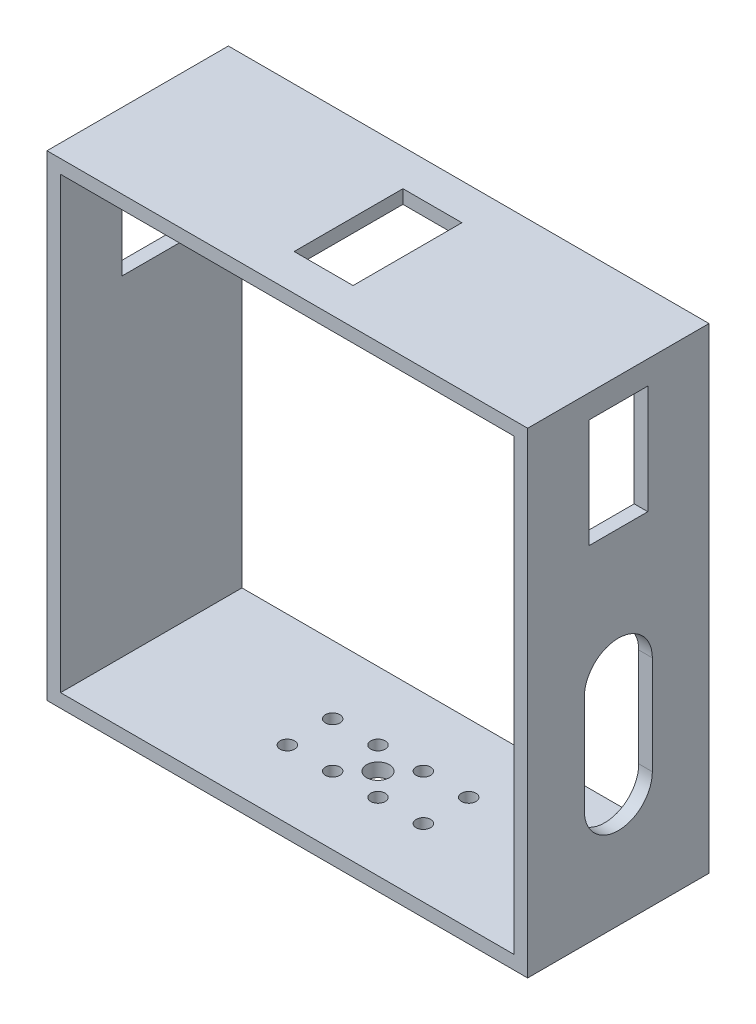
ISO-10303-21;
HEADER;
FILE_DESCRIPTION(('STEP AP214'),'2;1');
FILE_NAME('part.step','',(''),(''),'','','');
FILE_SCHEMA(('AUTOMOTIVE_DESIGN { 1 0 10303 214 1 1 1 1 }'));
ENDSEC;
DATA;
#1=APPLICATION_CONTEXT('core data for automotive mechanical design processes');
#2=APPLICATION_PROTOCOL_DEFINITION('international standard','automotive_design',2000,#1);
#3=PRODUCT_CONTEXT('',#1,'mechanical');
#4=PRODUCT('Part','Part','',(#3));
#5=PRODUCT_RELATED_PRODUCT_CATEGORY('part','',(#4));
#6=PRODUCT_DEFINITION_FORMATION('','',#4);
#7=PRODUCT_DEFINITION_CONTEXT('part definition',#1,'design');
#8=PRODUCT_DEFINITION('design','',#6,#7);
#9=PRODUCT_DEFINITION_SHAPE('','',#8);
#10=(LENGTH_UNIT() NAMED_UNIT(*) SI_UNIT(.MILLI.,.METRE.));
#11=(NAMED_UNIT(*) PLANE_ANGLE_UNIT() SI_UNIT($,.RADIAN.));
#12=(NAMED_UNIT(*) SI_UNIT($,.STERADIAN.) SOLID_ANGLE_UNIT());
#13=UNCERTAINTY_MEASURE_WITH_UNIT(LENGTH_MEASURE(1.E-05),#10,'distance_accuracy_value','');
#14=(GEOMETRIC_REPRESENTATION_CONTEXT(3) GLOBAL_UNCERTAINTY_ASSIGNED_CONTEXT((#13)) GLOBAL_UNIT_ASSIGNED_CONTEXT((#10,
#11,#12)) REPRESENTATION_CONTEXT('',''));
#15=CARTESIAN_POINT('',(0.,0.,0.));
#16=DIRECTION('',(0.,0.,1.));
#17=DIRECTION('',(1.,0.,0.));
#18=AXIS2_PLACEMENT_3D('',#15,#16,#17);
#19=CARTESIAN_POINT('',(-53.,105.,40.));
#20=DIRECTION('',(0.,-1.,0.));
#21=DIRECTION('',(0.,0.,-1.));
#22=AXIS2_PLACEMENT_3D('',#19,#20,#21);
#23=PLANE('',#22);
#24=DIRECTION('',(-1.,0.,0.));
#25=VECTOR('',#24,1.);
#26=CARTESIAN_POINT('',(-53.,105.,0.));
#27=LINE('',#26,#25);
#28=CARTESIAN_POINT('',(53.,105.,0.));
#29=VERTEX_POINT('',#28);
#30=CARTESIAN_POINT('',(-53.,105.,0.));
#31=VERTEX_POINT('',#30);
#32=EDGE_CURVE('E370',#29,#31,#27,.T.);
#33=ORIENTED_EDGE('',*,*,#32,.T.);
#34=DIRECTION('',(0.,0.,-1.));
#35=VECTOR('',#34,1.);
#36=CARTESIAN_POINT('',(-53.,105.,40.));
#37=LINE('',#36,#35);
#38=CARTESIAN_POINT('',(-53.,105.,40.));
#39=VERTEX_POINT('',#38);
#40=EDGE_CURVE('E380',#39,#31,#37,.T.);
#41=ORIENTED_EDGE('',*,*,#40,.F.);
#42=DIRECTION('',(-1.,0.,0.));
#43=VECTOR('',#42,1.);
#44=CARTESIAN_POINT('',(-53.,105.,40.));
#45=LINE('',#44,#43);
#46=CARTESIAN_POINT('',(53.,105.,40.));
#47=VERTEX_POINT('',#46);
#48=EDGE_CURVE('E360',#47,#39,#45,.T.);
#49=ORIENTED_EDGE('',*,*,#48,.F.);
#50=DIRECTION('',(0.,0.,-1.));
#51=VECTOR('',#50,1.);
#52=CARTESIAN_POINT('',(53.,105.,40.));
#53=LINE('',#52,#51);
#54=EDGE_CURVE('E383',#47,#29,#53,.T.);
#55=ORIENTED_EDGE('',*,*,#54,.T.);
#56=EDGE_LOOP('',(#33,#41,#49,#55));
#57=FACE_BOUND('',#56,.T.);
#58=DIRECTION('',(-1.,0.,0.));
#59=VECTOR('',#58,1.);
#60=CARTESIAN_POINT('',(-53.,105.,7.99999999999999));
#61=LINE('',#60,#59);
#62=CARTESIAN_POINT('',(6.50000000000001,105.,7.99999999999999));
#63=VERTEX_POINT('',#62);
#64=CARTESIAN_POINT('',(-6.50000000000001,105.,7.99999999999999));
#65=VERTEX_POINT('',#64);
#66=EDGE_CURVE('E277',#63,#65,#61,.T.);
#67=ORIENTED_EDGE('',*,*,#66,.F.);
#68=DIRECTION('',(0.,0.,-1.));
#69=VECTOR('',#68,1.);
#70=CARTESIAN_POINT('',(6.50000000000001,105.,40.));
#71=LINE('',#70,#69);
#72=CARTESIAN_POINT('',(6.50000000000001,105.,32.));
#73=VERTEX_POINT('',#72);
#74=EDGE_CURVE('E270',#73,#63,#71,.T.);
#75=ORIENTED_EDGE('',*,*,#74,.F.);
#76=DIRECTION('',(1.,0.,0.));
#77=VECTOR('',#76,1.);
#78=CARTESIAN_POINT('',(-53.,105.,32.));
#79=LINE('',#78,#77);
#80=CARTESIAN_POINT('',(-6.50000000000001,105.,32.));
#81=VERTEX_POINT('',#80);
#82=EDGE_CURVE('E272',#81,#73,#79,.T.);
#83=ORIENTED_EDGE('',*,*,#82,.F.);
#84=DIRECTION('',(0.,0.,1.));
#85=VECTOR('',#84,1.);
#86=CARTESIAN_POINT('',(-6.50000000000001,105.,40.));
#87=LINE('',#86,#85);
#88=EDGE_CURVE('E275',#65,#81,#87,.T.);
#89=ORIENTED_EDGE('',*,*,#88,.F.);
#90=EDGE_LOOP('',(#67,#75,#83,#89));
#91=FACE_BOUND('',#90,.T.);
#92=ADVANCED_FACE('F38',(#57,#91),#23,.F.);
#93=CARTESIAN_POINT('',(50.,102.,40.));
#94=DIRECTION('',(0.,1.,0.));
#95=DIRECTION('',(0.,0.,1.));
#96=AXIS2_PLACEMENT_3D('',#93,#94,#95);
#97=PLANE('',#96);
#98=DIRECTION('',(1.,0.,0.));
#99=VECTOR('',#98,1.);
#100=CARTESIAN_POINT('',(0.,102.,0.));
#101=LINE('',#100,#99);
#102=CARTESIAN_POINT('',(-50.,102.,0.));
#103=VERTEX_POINT('',#102);
#104=CARTESIAN_POINT('',(50.,102.,0.));
#105=VERTEX_POINT('',#104);
#106=EDGE_CURVE('E390',#103,#105,#101,.T.);
#107=ORIENTED_EDGE('',*,*,#106,.T.);
#108=DIRECTION('',(0.,0.,-1.));
#109=VECTOR('',#108,1.);
#110=CARTESIAN_POINT('',(50.,102.,40.));
#111=LINE('',#110,#109);
#112=CARTESIAN_POINT('',(50.,102.,40.));
#113=VERTEX_POINT('',#112);
#114=EDGE_CURVE('E346',#113,#105,#111,.T.);
#115=ORIENTED_EDGE('',*,*,#114,.F.);
#116=DIRECTION('',(1.,0.,0.));
#117=VECTOR('',#116,1.);
#118=CARTESIAN_POINT('',(50.,102.,40.));
#119=LINE('',#118,#117);
#120=CARTESIAN_POINT('',(-50.,102.,40.));
#121=VERTEX_POINT('',#120);
#122=EDGE_CURVE('E342',#121,#113,#119,.T.);
#123=ORIENTED_EDGE('',*,*,#122,.F.);
#124=DIRECTION('',(0.,0.,-1.));
#125=VECTOR('',#124,1.);
#126=CARTESIAN_POINT('',(-50.,102.,40.));
#127=LINE('',#126,#125);
#128=EDGE_CURVE('E350',#121,#103,#127,.T.);
#129=ORIENTED_EDGE('',*,*,#128,.T.);
#130=EDGE_LOOP('',(#107,#115,#123,#129));
#131=FACE_BOUND('',#130,.T.);
#132=DIRECTION('',(1.,0.,0.));
#133=VECTOR('',#132,1.);
#134=CARTESIAN_POINT('',(-6.50000000000001,102.,7.99999999999999));
#135=LINE('',#134,#133);
#136=CARTESIAN_POINT('',(-6.50000000000001,102.,7.99999999999999));
#137=VERTEX_POINT('',#136);
#138=CARTESIAN_POINT('',(6.50000000000001,102.,7.99999999999999));
#139=VERTEX_POINT('',#138);
#140=EDGE_CURVE('E253',#137,#139,#135,.T.);
#141=ORIENTED_EDGE('',*,*,#140,.F.);
#142=DIRECTION('',(0.,0.,-1.));
#143=VECTOR('',#142,1.);
#144=CARTESIAN_POINT('',(-6.50000000000001,102.,32.));
#145=LINE('',#144,#143);
#146=CARTESIAN_POINT('',(-6.50000000000001,102.,32.));
#147=VERTEX_POINT('',#146);
#148=EDGE_CURVE('E227',#147,#137,#145,.T.);
#149=ORIENTED_EDGE('',*,*,#148,.F.);
#150=DIRECTION('',(-1.,0.,0.));
#151=VECTOR('',#150,1.);
#152=CARTESIAN_POINT('',(-6.50000000000001,102.,32.));
#153=LINE('',#152,#151);
#154=CARTESIAN_POINT('',(6.50000000000001,102.,32.));
#155=VERTEX_POINT('',#154);
#156=EDGE_CURVE('E258',#155,#147,#153,.T.);
#157=ORIENTED_EDGE('',*,*,#156,.F.);
#158=DIRECTION('',(0.,0.,1.));
#159=VECTOR('',#158,1.);
#160=CARTESIAN_POINT('',(6.50000000000001,102.,32.));
#161=LINE('',#160,#159);
#162=EDGE_CURVE('E255',#139,#155,#161,.T.);
#163=ORIENTED_EDGE('',*,*,#162,.F.);
#164=EDGE_LOOP('',(#141,#149,#157,#163));
#165=FACE_BOUND('',#164,.T.);
#166=ADVANCED_FACE('F459',(#131,#165),#97,.F.);
#167=CARTESIAN_POINT('',(53.,0.,40.));
#168=DIRECTION('',(-1.,0.,0.));
#169=DIRECTION('',(0.,0.,1.));
#170=AXIS2_PLACEMENT_3D('',#167,#168,#169);
#171=PLANE('',#170);
#172=DIRECTION('',(0.,1.,0.));
#173=VECTOR('',#172,1.);
#174=CARTESIAN_POINT('',(53.,25.6499615268941,12.5));
#175=LINE('',#174,#173);
#176=CARTESIAN_POINT('',(53.,25.6499615268941,12.5));
#177=VERTEX_POINT('',#176);
#178=CARTESIAN_POINT('',(53.,47.3984690044533,12.5));
#179=VERTEX_POINT('',#178);
#180=EDGE_CURVE('E401',#177,#179,#175,.T.);
#181=ORIENTED_EDGE('',*,*,#180,.F.);
#182=CARTESIAN_POINT('',(53.,25.6499615268941,20.));
#183=DIRECTION('',(1.,0.,0.));
#184=DIRECTION('',(0.,0.,-1.));
#185=AXIS2_PLACEMENT_3D('',#182,#183,#184);
#186=CIRCLE('',#185,7.5);
#187=CARTESIAN_POINT('',(53.,25.6499615268941,27.5));
#188=VERTEX_POINT('',#187);
#189=EDGE_CURVE('E42',#188,#177,#186,.T.);
#190=ORIENTED_EDGE('',*,*,#189,.F.);
#191=DIRECTION('',(0.,1.,0.));
#192=VECTOR('',#191,1.);
#193=CARTESIAN_POINT('',(53.,25.6499615268941,27.5));
#194=LINE('',#193,#192);
#195=CARTESIAN_POINT('',(53.,47.3984690044533,27.5));
#196=VERTEX_POINT('',#195);
#197=EDGE_CURVE('E83',#196,#188,#194,.F.);
#198=ORIENTED_EDGE('',*,*,#197,.F.);
#199=CARTESIAN_POINT('',(53.,47.3984690044533,20.));
#200=DIRECTION('',(1.,0.,0.));
#201=DIRECTION('',(0.,0.,-1.));
#202=AXIS2_PLACEMENT_3D('',#199,#200,#201);
#203=CIRCLE('',#202,7.5);
#204=EDGE_CURVE('E403',#179,#196,#203,.T.);
#205=ORIENTED_EDGE('',*,*,#204,.F.);
#206=EDGE_LOOP('',(#181,#190,#198,#205));
#207=FACE_BOUND('',#206,.T.);
#208=DIRECTION('',(0.,0.,-1.));
#209=VECTOR('',#208,1.);
#210=CARTESIAN_POINT('',(53.,99.8069523570362,26.5));
#211=LINE('',#210,#209);
#212=CARTESIAN_POINT('',(53.,99.8069523570362,26.5));
#213=VERTEX_POINT('',#212);
#214=CARTESIAN_POINT('',(53.,99.8069523570362,13.5));
#215=VERTEX_POINT('',#214);
#216=EDGE_CURVE('E217',#213,#215,#211,.T.);
#217=ORIENTED_EDGE('',*,*,#216,.T.);
#218=DIRECTION('',(0.,-1.,0.));
#219=VECTOR('',#218,1.);
#220=CARTESIAN_POINT('',(53.,99.8069523570362,13.5));
#221=LINE('',#220,#219);
#222=CARTESIAN_POINT('',(53.,75.8069523570362,13.5));
#223=VERTEX_POINT('',#222);
#224=EDGE_CURVE('E405',#215,#223,#221,.T.);
#225=ORIENTED_EDGE('',*,*,#224,.T.);
#226=DIRECTION('',(0.,0.,1.));
#227=VECTOR('',#226,1.);
#228=CARTESIAN_POINT('',(53.,75.8069523570362,13.5));
#229=LINE('',#228,#227);
#230=CARTESIAN_POINT('',(53.,75.8069523570362,26.5));
#231=VERTEX_POINT('',#230);
#232=EDGE_CURVE('E410',#223,#231,#229,.T.);
#233=ORIENTED_EDGE('',*,*,#232,.T.);
#234=DIRECTION('',(0.,1.,0.));
#235=VECTOR('',#234,1.);
#236=CARTESIAN_POINT('',(53.,75.8069523570362,26.5));
#237=LINE('',#236,#235);
#238=EDGE_CURVE('E415',#231,#213,#237,.T.);
#239=ORIENTED_EDGE('',*,*,#238,.T.);
#240=EDGE_LOOP('',(#217,#225,#233,#239));
#241=FACE_BOUND('',#240,.T.);
#242=DIRECTION('',(0.,1.,0.));
#243=VECTOR('',#242,1.);
#244=CARTESIAN_POINT('',(53.,0.,0.));
#245=LINE('',#244,#243);
#246=CARTESIAN_POINT('',(53.,0.,0.));
#247=VERTEX_POINT('',#246);
#248=EDGE_CURVE('E349',#247,#29,#245,.T.);
#249=ORIENTED_EDGE('',*,*,#248,.T.);
#250=ORIENTED_EDGE('',*,*,#54,.F.);
#251=DIRECTION('',(0.,1.,0.));
#252=VECTOR('',#251,1.);
#253=CARTESIAN_POINT('',(53.,0.,40.));
#254=LINE('',#253,#252);
#255=CARTESIAN_POINT('',(53.,0.,40.));
#256=VERTEX_POINT('',#255);
#257=EDGE_CURVE('E357',#256,#47,#254,.T.);
#258=ORIENTED_EDGE('',*,*,#257,.F.);
#259=DIRECTION('',(0.,0.,-1.));
#260=VECTOR('',#259,1.);
#261=CARTESIAN_POINT('',(53.,0.,40.));
#262=LINE('',#261,#260);
#263=EDGE_CURVE('E367',#256,#247,#262,.T.);
#264=ORIENTED_EDGE('',*,*,#263,.T.);
#265=EDGE_LOOP('',(#249,#250,#258,#264));
#266=FACE_BOUND('',#265,.T.);
#267=ADVANCED_FACE('F40',(#207,#241,#266),#171,.F.);
#268=CARTESIAN_POINT('',(-53.,0.,40.));
#269=DIRECTION('',(1.,0.,0.));
#270=DIRECTION('',(0.,0.,-1.));
#271=AXIS2_PLACEMENT_3D('',#268,#269,#270);
#272=PLANE('',#271);
#273=DIRECTION('',(0.,0.,-1.));
#274=VECTOR('',#273,1.);
#275=CARTESIAN_POINT('',(-53.,75.8069523570362,40.));
#276=LINE('',#275,#274);
#277=CARTESIAN_POINT('',(-53.,75.8069523570362,26.5));
#278=VERTEX_POINT('',#277);
#279=CARTESIAN_POINT('',(-53.,75.8069523570362,13.5));
#280=VERTEX_POINT('',#279);
#281=EDGE_CURVE('E212',#278,#280,#276,.T.);
#282=ORIENTED_EDGE('',*,*,#281,.T.);
#283=DIRECTION('',(0.,1.,0.));
#284=VECTOR('',#283,1.);
#285=CARTESIAN_POINT('',(-53.,0.,13.5));
#286=LINE('',#285,#284);
#287=CARTESIAN_POINT('',(-53.,99.8069523570362,13.5));
#288=VERTEX_POINT('',#287);
#289=EDGE_CURVE('E221',#280,#288,#286,.T.);
#290=ORIENTED_EDGE('',*,*,#289,.T.);
#291=DIRECTION('',(0.,0.,1.));
#292=VECTOR('',#291,1.);
#293=CARTESIAN_POINT('',(-53.,99.8069523570362,40.));
#294=LINE('',#293,#292);
#295=CARTESIAN_POINT('',(-53.,99.8069523570362,26.5));
#296=VERTEX_POINT('',#295);
#297=EDGE_CURVE('E247',#288,#296,#294,.T.);
#298=ORIENTED_EDGE('',*,*,#297,.T.);
#299=DIRECTION('',(0.,-1.,0.));
#300=VECTOR('',#299,1.);
#301=CARTESIAN_POINT('',(-53.,0.,26.5));
#302=LINE('',#301,#300);
#303=EDGE_CURVE('E233',#296,#278,#302,.T.);
#304=ORIENTED_EDGE('',*,*,#303,.T.);
#305=EDGE_LOOP('',(#282,#290,#298,#304));
#306=FACE_BOUND('',#305,.T.);
#307=DIRECTION('',(0.,-1.,0.));
#308=VECTOR('',#307,1.);
#309=CARTESIAN_POINT('',(-53.,0.,0.));
#310=LINE('',#309,#308);
#311=CARTESIAN_POINT('',(-53.,0.,0.));
#312=VERTEX_POINT('',#311);
#313=EDGE_CURVE('E372',#31,#312,#310,.T.);
#314=ORIENTED_EDGE('',*,*,#313,.T.);
#315=DIRECTION('',(0.,0.,-1.));
#316=VECTOR('',#315,1.);
#317=CARTESIAN_POINT('',(-53.,0.,40.));
#318=LINE('',#317,#316);
#319=CARTESIAN_POINT('',(-53.,0.,40.));
#320=VERTEX_POINT('',#319);
#321=EDGE_CURVE('E377',#320,#312,#318,.T.);
#322=ORIENTED_EDGE('',*,*,#321,.F.);
#323=DIRECTION('',(0.,-1.,0.));
#324=VECTOR('',#323,1.);
#325=CARTESIAN_POINT('',(-53.,0.,40.));
#326=LINE('',#325,#324);
#327=EDGE_CURVE('E363',#39,#320,#326,.T.);
#328=ORIENTED_EDGE('',*,*,#327,.F.);
#329=ORIENTED_EDGE('',*,*,#40,.T.);
#330=EDGE_LOOP('',(#314,#322,#328,#329));
#331=FACE_BOUND('',#330,.T.);
#332=ADVANCED_FACE('F231',(#306,#331),#272,.F.);
#333=CARTESIAN_POINT('',(-53.,0.,40.));
#334=DIRECTION('',(0.,1.,0.));
#335=DIRECTION('',(-1.,0.,0.));
#336=AXIS2_PLACEMENT_3D('',#333,#334,#335);
#337=PLANE('',#336);
#338=CARTESIAN_POINT('',(5.00000000000004,0.,25.));
#339=DIRECTION('',(0.,1.,0.));
#340=DIRECTION('',(-1.,0.,0.));
#341=AXIS2_PLACEMENT_3D('',#338,#339,#340);
#342=CIRCLE('',#341,1.6);
#343=CARTESIAN_POINT('',(3.40000000000004,0.,25.));
#344=VERTEX_POINT('',#343);
#345=EDGE_CURVE('E330',#344,#344,#342,.F.);
#346=ORIENTED_EDGE('',*,*,#345,.F.);
#347=EDGE_LOOP('',(#346));
#348=FACE_BOUND('',#347,.T.);
#349=CARTESIAN_POINT('',(5.00000000000004,0.,15.));
#350=DIRECTION('',(0.,1.,0.));
#351=DIRECTION('',(-1.,0.,0.));
#352=AXIS2_PLACEMENT_3D('',#349,#350,#351);
#353=CIRCLE('',#352,1.6);
#354=CARTESIAN_POINT('',(3.40000000000004,0.,15.));
#355=VERTEX_POINT('',#354);
#356=EDGE_CURVE('E327',#355,#355,#353,.F.);
#357=ORIENTED_EDGE('',*,*,#356,.F.);
#358=EDGE_LOOP('',(#357));
#359=FACE_BOUND('',#358,.T.);
#360=CARTESIAN_POINT('',(-4.99999999999996,0.,15.));
#361=DIRECTION('',(0.,1.,0.));
#362=DIRECTION('',(-1.,0.,0.));
#363=AXIS2_PLACEMENT_3D('',#360,#361,#362);
#364=CIRCLE('',#363,1.6);
#365=CARTESIAN_POINT('',(-6.59999999999996,0.,15.));
#366=VERTEX_POINT('',#365);
#367=EDGE_CURVE('E324',#366,#366,#364,.F.);
#368=ORIENTED_EDGE('',*,*,#367,.F.);
#369=EDGE_LOOP('',(#368));
#370=FACE_BOUND('',#369,.T.);
#371=CARTESIAN_POINT('',(-4.99999999999996,0.,25.));
#372=DIRECTION('',(0.,1.,0.));
#373=DIRECTION('',(-1.,0.,0.));
#374=AXIS2_PLACEMENT_3D('',#371,#372,#373);
#375=CIRCLE('',#374,1.6);
#376=CARTESIAN_POINT('',(-6.59999999999996,0.,25.));
#377=VERTEX_POINT('',#376);
#378=EDGE_CURVE('E321',#377,#377,#375,.F.);
#379=ORIENTED_EDGE('',*,*,#378,.F.);
#380=EDGE_LOOP('',(#379));
#381=FACE_BOUND('',#380,.T.);
#382=CARTESIAN_POINT('',(15.,0.,25.));
#383=DIRECTION('',(0.,1.,0.));
#384=DIRECTION('',(-1.,0.,0.));
#385=AXIS2_PLACEMENT_3D('',#382,#383,#384);
#386=CIRCLE('',#385,1.6);
#387=CARTESIAN_POINT('',(13.4,0.,25.));
#388=VERTEX_POINT('',#387);
#389=EDGE_CURVE('E318',#388,#388,#386,.F.);
#390=ORIENTED_EDGE('',*,*,#389,.F.);
#391=EDGE_LOOP('',(#390));
#392=FACE_BOUND('',#391,.T.);
#393=CARTESIAN_POINT('',(-15.,0.,25.));
#394=DIRECTION('',(0.,1.,0.));
#395=DIRECTION('',(-1.,0.,0.));
#396=AXIS2_PLACEMENT_3D('',#393,#394,#395);
#397=CIRCLE('',#396,1.6);
#398=CARTESIAN_POINT('',(-16.6,0.,25.));
#399=VERTEX_POINT('',#398);
#400=EDGE_CURVE('E315',#399,#399,#397,.F.);
#401=ORIENTED_EDGE('',*,*,#400,.F.);
#402=EDGE_LOOP('',(#401));
#403=FACE_BOUND('',#402,.T.);
#404=CARTESIAN_POINT('',(15.,0.,15.));
#405=DIRECTION('',(0.,1.,0.));
#406=DIRECTION('',(-1.,0.,0.));
#407=AXIS2_PLACEMENT_3D('',#404,#405,#406);
#408=CIRCLE('',#407,1.6);
#409=CARTESIAN_POINT('',(13.4,0.,15.));
#410=VERTEX_POINT('',#409);
#411=EDGE_CURVE('E312',#410,#410,#408,.F.);
#412=ORIENTED_EDGE('',*,*,#411,.F.);
#413=EDGE_LOOP('',(#412));
#414=FACE_BOUND('',#413,.T.);
#415=CARTESIAN_POINT('',(-15.,0.,15.));
#416=DIRECTION('',(0.,1.,0.));
#417=DIRECTION('',(-1.,0.,0.));
#418=AXIS2_PLACEMENT_3D('',#415,#416,#417);
#419=CIRCLE('',#418,1.6);
#420=CARTESIAN_POINT('',(-16.6,0.,15.));
#421=VERTEX_POINT('',#420);
#422=EDGE_CURVE('E309',#421,#421,#419,.F.);
#423=ORIENTED_EDGE('',*,*,#422,.F.);
#424=EDGE_LOOP('',(#423));
#425=FACE_BOUND('',#424,.T.);
#426=CARTESIAN_POINT('',(0.,0.,20.));
#427=DIRECTION('',(0.,1.,0.));
#428=DIRECTION('',(-1.,0.,0.));
#429=AXIS2_PLACEMENT_3D('',#426,#427,#428);
#430=CIRCLE('',#429,2.5);
#431=CARTESIAN_POINT('',(-2.49999999999996,0.,20.));
#432=VERTEX_POINT('',#431);
#433=EDGE_CURVE('E306',#432,#432,#430,.F.);
#434=ORIENTED_EDGE('',*,*,#433,.F.);
#435=EDGE_LOOP('',(#434));
#436=FACE_BOUND('',#435,.T.);
#437=DIRECTION('',(1.,0.,0.));
#438=VECTOR('',#437,1.);
#439=CARTESIAN_POINT('',(-53.,0.,0.));
#440=LINE('',#439,#438);
#441=EDGE_CURVE('E361',#312,#247,#440,.T.);
#442=ORIENTED_EDGE('',*,*,#441,.T.);
#443=ORIENTED_EDGE('',*,*,#263,.F.);
#444=DIRECTION('',(1.,0.,0.));
#445=VECTOR('',#444,1.);
#446=CARTESIAN_POINT('',(-53.,0.,40.));
#447=LINE('',#446,#445);
#448=EDGE_CURVE('E365',#320,#256,#447,.T.);
#449=ORIENTED_EDGE('',*,*,#448,.F.);
#450=ORIENTED_EDGE('',*,*,#321,.T.);
#451=EDGE_LOOP('',(#442,#443,#449,#450));
#452=FACE_BOUND('',#451,.T.);
#453=ADVANCED_FACE('F470',(#348,#359,#370,#381,#392,#403,#414,#425,#436,#452),#337,.F.);
#454=CARTESIAN_POINT('',(0.,0.,40.));
#455=DIRECTION('',(0.,0.,-1.));
#456=DIRECTION('',(-1.,0.,0.));
#457=AXIS2_PLACEMENT_3D('',#454,#455,#456);
#458=PLANE('',#457);
#459=ORIENTED_EDGE('',*,*,#122,.T.);
#460=DIRECTION('',(0.,-1.,0.));
#461=VECTOR('',#460,1.);
#462=CARTESIAN_POINT('',(50.,102.,40.));
#463=LINE('',#462,#461);
#464=CARTESIAN_POINT('',(50.0000000000001,2.99999999999999,40.));
#465=VERTEX_POINT('',#464);
#466=EDGE_CURVE('E333',#113,#465,#463,.T.);
#467=ORIENTED_EDGE('',*,*,#466,.T.);
#468=DIRECTION('',(-1.,0.,0.));
#469=VECTOR('',#468,1.);
#470=CARTESIAN_POINT('',(50.0000000000001,2.99999999999999,40.));
#471=LINE('',#470,#469);
#472=CARTESIAN_POINT('',(-50.0000000000001,2.99999999999999,40.));
#473=VERTEX_POINT('',#472);
#474=EDGE_CURVE('E336',#465,#473,#471,.T.);
#475=ORIENTED_EDGE('',*,*,#474,.T.);
#476=DIRECTION('',(0.,1.,0.));
#477=VECTOR('',#476,1.);
#478=CARTESIAN_POINT('',(-50.,102.,40.));
#479=LINE('',#478,#477);
#480=EDGE_CURVE('E339',#473,#121,#479,.T.);
#481=ORIENTED_EDGE('',*,*,#480,.T.);
#482=EDGE_LOOP('',(#459,#467,#475,#481));
#483=FACE_BOUND('',#482,.T.);
#484=ORIENTED_EDGE('',*,*,#257,.T.);
#485=ORIENTED_EDGE('',*,*,#48,.T.);
#486=ORIENTED_EDGE('',*,*,#327,.T.);
#487=ORIENTED_EDGE('',*,*,#448,.T.);
#488=EDGE_LOOP('',(#484,#485,#486,#487));
#489=FACE_BOUND('',#488,.T.);
#490=ADVANCED_FACE('F473',(#483,#489),#458,.F.);
#491=CARTESIAN_POINT('',(0.,0.,0.));
#492=DIRECTION('',(0.,0.,-1.));
#493=DIRECTION('',(-1.,0.,0.));
#494=AXIS2_PLACEMENT_3D('',#491,#492,#493);
#495=PLANE('',#494);
#496=DIRECTION('',(0.,-1.,0.));
#497=VECTOR('',#496,1.);
#498=CARTESIAN_POINT('',(50.0000000000001,0.,0.));
#499=LINE('',#498,#497);
#500=CARTESIAN_POINT('',(50.0000000000001,2.99999999999999,0.));
#501=VERTEX_POINT('',#500);
#502=EDGE_CURVE('E392',#105,#501,#499,.T.);
#503=ORIENTED_EDGE('',*,*,#502,.F.);
#504=ORIENTED_EDGE('',*,*,#106,.F.);
#505=DIRECTION('',(0.,1.,0.));
#506=VECTOR('',#505,1.);
#507=CARTESIAN_POINT('',(-50.0000000000001,0.,0.));
#508=LINE('',#507,#506);
#509=CARTESIAN_POINT('',(-50.0000000000001,2.99999999999999,0.));
#510=VERTEX_POINT('',#509);
#511=EDGE_CURVE('E388',#510,#103,#508,.T.);
#512=ORIENTED_EDGE('',*,*,#511,.F.);
#513=DIRECTION('',(-1.,0.,0.));
#514=VECTOR('',#513,1.);
#515=CARTESIAN_POINT('',(0.,2.99999999999999,0.));
#516=LINE('',#515,#514);
#517=EDGE_CURVE('E386',#501,#510,#516,.T.);
#518=ORIENTED_EDGE('',*,*,#517,.F.);
#519=EDGE_LOOP('',(#503,#504,#512,#518));
#520=FACE_BOUND('',#519,.T.);
#521=ORIENTED_EDGE('',*,*,#248,.F.);
#522=ORIENTED_EDGE('',*,*,#441,.F.);
#523=ORIENTED_EDGE('',*,*,#313,.F.);
#524=ORIENTED_EDGE('',*,*,#32,.F.);
#525=EDGE_LOOP('',(#521,#522,#523,#524));
#526=FACE_BOUND('',#525,.T.);
#527=ADVANCED_FACE('F475',(#520,#526),#495,.T.);
#528=CARTESIAN_POINT('',(50.,102.,40.));
#529=DIRECTION('',(1.,0.,0.));
#530=DIRECTION('',(0.,1.,0.));
#531=AXIS2_PLACEMENT_3D('',#528,#529,#530);
#532=PLANE('',#531);
#533=DIRECTION('',(0.,1.,0.));
#534=VECTOR('',#533,1.);
#535=CARTESIAN_POINT('',(50.0000000000001,25.6499615268942,27.5));
#536=LINE('',#535,#534);
#537=CARTESIAN_POINT('',(50.0000000000001,25.6499615268941,27.5));
#538=VERTEX_POINT('',#537);
#539=CARTESIAN_POINT('',(50.0000000000001,47.3984690044533,27.5));
#540=VERTEX_POINT('',#539);
#541=EDGE_CURVE('E859',#538,#540,#536,.T.);
#542=ORIENTED_EDGE('',*,*,#541,.F.);
#543=CARTESIAN_POINT('',(50.0000000000001,25.6499615268941,20.));
#544=DIRECTION('',(1.,0.,0.));
#545=DIRECTION('',(0.,1.,0.));
#546=AXIS2_PLACEMENT_3D('',#543,#544,#545);
#547=CIRCLE('',#546,7.5);
#548=CARTESIAN_POINT('',(50.0000000000001,25.6499615268941,12.5));
#549=VERTEX_POINT('',#548);
#550=EDGE_CURVE('E853',#549,#538,#547,.F.);
#551=ORIENTED_EDGE('',*,*,#550,.F.);
#552=DIRECTION('',(0.,-1.,0.));
#553=VECTOR('',#552,1.);
#554=CARTESIAN_POINT('',(50.0000000000001,25.6499615268942,12.5));
#555=LINE('',#554,#553);
#556=CARTESIAN_POINT('',(50.,47.3984690044533,12.5));
#557=VERTEX_POINT('',#556);
#558=EDGE_CURVE('E404',#557,#549,#555,.T.);
#559=ORIENTED_EDGE('',*,*,#558,.F.);
#560=CARTESIAN_POINT('',(50.0000000000001,47.3984690044533,20.));
#561=DIRECTION('',(1.,0.,0.));
#562=DIRECTION('',(0.,1.,0.));
#563=AXIS2_PLACEMENT_3D('',#560,#561,#562);
#564=CIRCLE('',#563,7.5);
#565=EDGE_CURVE('E64',#540,#557,#564,.F.);
#566=ORIENTED_EDGE('',*,*,#565,.F.);
#567=EDGE_LOOP('',(#542,#551,#559,#566));
#568=FACE_BOUND('',#567,.T.);
#569=DIRECTION('',(0.,0.,-1.));
#570=VECTOR('',#569,1.);
#571=CARTESIAN_POINT('',(50.,75.8069523570362,40.));
#572=LINE('',#571,#570);
#573=CARTESIAN_POINT('',(50.,75.8069523570362,26.5));
#574=VERTEX_POINT('',#573);
#575=CARTESIAN_POINT('',(50.,75.8069523570362,13.5));
#576=VERTEX_POINT('',#575);
#577=EDGE_CURVE('E235',#574,#576,#572,.T.);
#578=ORIENTED_EDGE('',*,*,#577,.T.);
#579=DIRECTION('',(0.,1.,0.));
#580=VECTOR('',#579,1.);
#581=CARTESIAN_POINT('',(50.,102.,13.5));
#582=LINE('',#581,#580);
#583=CARTESIAN_POINT('',(50.,99.8069523570362,13.5));
#584=VERTEX_POINT('',#583);
#585=EDGE_CURVE('E228',#576,#584,#582,.T.);
#586=ORIENTED_EDGE('',*,*,#585,.T.);
#587=DIRECTION('',(0.,0.,1.));
#588=VECTOR('',#587,1.);
#589=CARTESIAN_POINT('',(50.,99.8069523570362,40.));
#590=LINE('',#589,#588);
#591=CARTESIAN_POINT('',(50.,99.8069523570362,26.5));
#592=VERTEX_POINT('',#591);
#593=EDGE_CURVE('E244',#584,#592,#590,.T.);
#594=ORIENTED_EDGE('',*,*,#593,.T.);
#595=DIRECTION('',(0.,-1.,0.));
#596=VECTOR('',#595,1.);
#597=CARTESIAN_POINT('',(50.,102.,26.5));
#598=LINE('',#597,#596);
#599=EDGE_CURVE('E234',#592,#574,#598,.T.);
#600=ORIENTED_EDGE('',*,*,#599,.T.);
#601=EDGE_LOOP('',(#578,#586,#594,#600));
#602=FACE_BOUND('',#601,.T.);
#603=ORIENTED_EDGE('',*,*,#502,.T.);
#604=DIRECTION('',(0.,0.,-1.));
#605=VECTOR('',#604,1.);
#606=CARTESIAN_POINT('',(50.0000000000001,2.99999999999999,40.));
#607=LINE('',#606,#605);
#608=EDGE_CURVE('E345',#465,#501,#607,.T.);
#609=ORIENTED_EDGE('',*,*,#608,.F.);
#610=ORIENTED_EDGE('',*,*,#466,.F.);
#611=ORIENTED_EDGE('',*,*,#114,.T.);
#612=EDGE_LOOP('',(#603,#609,#610,#611));
#613=FACE_BOUND('',#612,.T.);
#614=ADVANCED_FACE('F478',(#568,#602,#613),#532,.F.);
#615=CARTESIAN_POINT('',(-50.,102.,40.));
#616=DIRECTION('',(-1.,0.,0.));
#617=DIRECTION('',(0.,-1.,0.));
#618=AXIS2_PLACEMENT_3D('',#615,#616,#617);
#619=PLANE('',#618);
#620=DIRECTION('',(0.,0.,-1.));
#621=VECTOR('',#620,1.);
#622=CARTESIAN_POINT('',(-50.,99.8069523570362,40.));
#623=LINE('',#622,#621);
#624=CARTESIAN_POINT('',(-50.,99.8069523570362,26.5));
#625=VERTEX_POINT('',#624);
#626=CARTESIAN_POINT('',(-50.,99.8069523570362,13.5));
#627=VERTEX_POINT('',#626);
#628=EDGE_CURVE('E47',#625,#627,#623,.T.);
#629=ORIENTED_EDGE('',*,*,#628,.T.);
#630=DIRECTION('',(0.,-1.,0.));
#631=VECTOR('',#630,1.);
#632=CARTESIAN_POINT('',(-50.,102.,13.5));
#633=LINE('',#632,#631);
#634=CARTESIAN_POINT('',(-50.,75.8069523570362,13.5));
#635=VERTEX_POINT('',#634);
#636=EDGE_CURVE('E11',#627,#635,#633,.T.);
#637=ORIENTED_EDGE('',*,*,#636,.T.);
#638=DIRECTION('',(0.,0.,1.));
#639=VECTOR('',#638,1.);
#640=CARTESIAN_POINT('',(-50.,75.8069523570362,40.));
#641=LINE('',#640,#639);
#642=CARTESIAN_POINT('',(-50.,75.8069523570362,26.5));
#643=VERTEX_POINT('',#642);
#644=EDGE_CURVE('E215',#635,#643,#641,.T.);
#645=ORIENTED_EDGE('',*,*,#644,.T.);
#646=DIRECTION('',(0.,1.,0.));
#647=VECTOR('',#646,1.);
#648=CARTESIAN_POINT('',(-50.,102.,26.5));
#649=LINE('',#648,#647);
#650=EDGE_CURVE('E396',#643,#625,#649,.T.);
#651=ORIENTED_EDGE('',*,*,#650,.T.);
#652=EDGE_LOOP('',(#629,#637,#645,#651));
#653=FACE_BOUND('',#652,.T.);
#654=ORIENTED_EDGE('',*,*,#511,.T.);
#655=ORIENTED_EDGE('',*,*,#128,.F.);
#656=ORIENTED_EDGE('',*,*,#480,.F.);
#657=DIRECTION('',(0.,0.,-1.));
#658=VECTOR('',#657,1.);
#659=CARTESIAN_POINT('',(-50.0000000000001,2.99999999999999,40.));
#660=LINE('',#659,#658);
#661=EDGE_CURVE('E353',#473,#510,#660,.T.);
#662=ORIENTED_EDGE('',*,*,#661,.T.);
#663=EDGE_LOOP('',(#654,#655,#656,#662));
#664=FACE_BOUND('',#663,.T.);
#665=ADVANCED_FACE('F440',(#653,#664),#619,.F.);
#666=CARTESIAN_POINT('',(50.0000000000001,2.99999999999999,40.));
#667=DIRECTION('',(0.,-1.,0.));
#668=DIRECTION('',(0.,0.,-1.));
#669=AXIS2_PLACEMENT_3D('',#666,#667,#668);
#670=PLANE('',#669);
#671=CARTESIAN_POINT('',(5.00000000000004,3.,25.));
#672=DIRECTION('',(0.,-1.,0.));
#673=DIRECTION('',(1.,0.,0.));
#674=AXIS2_PLACEMENT_3D('',#671,#672,#673);
#675=CIRCLE('',#674,1.6);
#676=CARTESIAN_POINT('',(6.60000000000004,3.,25.));
#677=VERTEX_POINT('',#676);
#678=EDGE_CURVE('E292',#677,#677,#675,.T.);
#679=ORIENTED_EDGE('',*,*,#678,.T.);
#680=EDGE_LOOP('',(#679));
#681=FACE_BOUND('',#680,.T.);
#682=CARTESIAN_POINT('',(5.00000000000004,3.,15.));
#683=DIRECTION('',(0.,-1.,0.));
#684=DIRECTION('',(1.,0.,0.));
#685=AXIS2_PLACEMENT_3D('',#682,#683,#684);
#686=CIRCLE('',#685,1.6);
#687=CARTESIAN_POINT('',(6.60000000000004,3.,15.));
#688=VERTEX_POINT('',#687);
#689=EDGE_CURVE('E296',#688,#688,#686,.T.);
#690=ORIENTED_EDGE('',*,*,#689,.T.);
#691=EDGE_LOOP('',(#690));
#692=FACE_BOUND('',#691,.T.);
#693=CARTESIAN_POINT('',(-4.99999999999996,3.,15.));
#694=DIRECTION('',(0.,-1.,0.));
#695=DIRECTION('',(1.,0.,0.));
#696=AXIS2_PLACEMENT_3D('',#693,#694,#695);
#697=CIRCLE('',#696,1.6);
#698=CARTESIAN_POINT('',(-3.39999999999996,3.,15.));
#699=VERTEX_POINT('',#698);
#700=EDGE_CURVE('E299',#699,#699,#697,.T.);
#701=ORIENTED_EDGE('',*,*,#700,.T.);
#702=EDGE_LOOP('',(#701));
#703=FACE_BOUND('',#702,.T.);
#704=CARTESIAN_POINT('',(-4.99999999999996,3.,25.));
#705=DIRECTION('',(0.,-1.,0.));
#706=DIRECTION('',(1.,0.,0.));
#707=AXIS2_PLACEMENT_3D('',#704,#705,#706);
#708=CIRCLE('',#707,1.6);
#709=CARTESIAN_POINT('',(-3.39999999999996,3.,25.));
#710=VERTEX_POINT('',#709);
#711=EDGE_CURVE('E283',#710,#710,#708,.T.);
#712=ORIENTED_EDGE('',*,*,#711,.T.);
#713=EDGE_LOOP('',(#712));
#714=FACE_BOUND('',#713,.T.);
#715=CARTESIAN_POINT('',(15.,3.,25.));
#716=DIRECTION('',(0.,-1.,0.));
#717=DIRECTION('',(1.,0.,0.));
#718=AXIS2_PLACEMENT_3D('',#715,#716,#717);
#719=CIRCLE('',#718,1.6);
#720=CARTESIAN_POINT('',(16.6,3.,25.));
#721=VERTEX_POINT('',#720);
#722=EDGE_CURVE('E280',#721,#721,#719,.T.);
#723=ORIENTED_EDGE('',*,*,#722,.T.);
#724=EDGE_LOOP('',(#723));
#725=FACE_BOUND('',#724,.T.);
#726=CARTESIAN_POINT('',(-15.,3.,25.));
#727=DIRECTION('',(0.,-1.,0.));
#728=DIRECTION('',(-1.,0.,0.));
#729=AXIS2_PLACEMENT_3D('',#726,#727,#728);
#730=CIRCLE('',#729,1.6);
#731=CARTESIAN_POINT('',(-16.6,3.,25.));
#732=VERTEX_POINT('',#731);
#733=EDGE_CURVE('E284',#732,#732,#730,.T.);
#734=ORIENTED_EDGE('',*,*,#733,.T.);
#735=EDGE_LOOP('',(#734));
#736=FACE_BOUND('',#735,.T.);
#737=CARTESIAN_POINT('',(15.,3.,15.));
#738=DIRECTION('',(0.,-1.,0.));
#739=DIRECTION('',(-1.,0.,0.));
#740=AXIS2_PLACEMENT_3D('',#737,#738,#739);
#741=CIRCLE('',#740,1.6);
#742=CARTESIAN_POINT('',(13.4,3.,15.));
#743=VERTEX_POINT('',#742);
#744=EDGE_CURVE('E287',#743,#743,#741,.T.);
#745=ORIENTED_EDGE('',*,*,#744,.T.);
#746=EDGE_LOOP('',(#745));
#747=FACE_BOUND('',#746,.T.);
#748=CARTESIAN_POINT('',(-15.,3.,15.));
#749=DIRECTION('',(0.,-1.,0.));
#750=DIRECTION('',(1.,0.,0.));
#751=AXIS2_PLACEMENT_3D('',#748,#749,#750);
#752=CIRCLE('',#751,1.6);
#753=CARTESIAN_POINT('',(-13.4,3.,15.));
#754=VERTEX_POINT('',#753);
#755=EDGE_CURVE('E279',#754,#754,#752,.T.);
#756=ORIENTED_EDGE('',*,*,#755,.T.);
#757=EDGE_LOOP('',(#756));
#758=FACE_BOUND('',#757,.T.);
#759=CARTESIAN_POINT('',(0.,3.,20.));
#760=DIRECTION('',(0.,-1.,0.));
#761=DIRECTION('',(1.,0.,0.));
#762=AXIS2_PLACEMENT_3D('',#759,#760,#761);
#763=CIRCLE('',#762,2.5);
#764=CARTESIAN_POINT('',(2.50000000000004,3.,20.));
#765=VERTEX_POINT('',#764);
#766=EDGE_CURVE('E295',#765,#765,#763,.T.);
#767=ORIENTED_EDGE('',*,*,#766,.T.);
#768=EDGE_LOOP('',(#767));
#769=FACE_BOUND('',#768,.T.);
#770=ORIENTED_EDGE('',*,*,#517,.T.);
#771=ORIENTED_EDGE('',*,*,#661,.F.);
#772=ORIENTED_EDGE('',*,*,#474,.F.);
#773=ORIENTED_EDGE('',*,*,#608,.T.);
#774=EDGE_LOOP('',(#770,#771,#772,#773));
#775=FACE_BOUND('',#774,.T.);
#776=ADVANCED_FACE('F486',(#681,#692,#703,#714,#725,#736,#747,#758,#769,#775),#670,.F.);
#777=CARTESIAN_POINT('',(0.,-0.999999999999997,20.));
#778=DIRECTION('',(0.,1.,0.));
#779=DIRECTION('',(-1.,0.,0.));
#780=AXIS2_PLACEMENT_3D('',#777,#778,#779);
#781=CYLINDRICAL_SURFACE('',#780,2.5);
#782=ORIENTED_EDGE('',*,*,#766,.F.);
#783=EDGE_LOOP('',(#782));
#784=FACE_BOUND('',#783,.T.);
#785=ORIENTED_EDGE('',*,*,#433,.T.);
#786=EDGE_LOOP('',(#785));
#787=FACE_BOUND('',#786,.T.);
#788=ADVANCED_FACE('F489',(#784,#787),#781,.F.);
#789=CARTESIAN_POINT('',(-15.,-0.999999999999993,15.));
#790=DIRECTION('',(0.,1.,0.));
#791=DIRECTION('',(-1.,0.,0.));
#792=AXIS2_PLACEMENT_3D('',#789,#790,#791);
#793=CYLINDRICAL_SURFACE('',#792,1.6);
#794=ORIENTED_EDGE('',*,*,#755,.F.);
#795=EDGE_LOOP('',(#794));
#796=FACE_BOUND('',#795,.T.);
#797=ORIENTED_EDGE('',*,*,#422,.T.);
#798=EDGE_LOOP('',(#797));
#799=FACE_BOUND('',#798,.T.);
#800=ADVANCED_FACE('F495',(#796,#799),#793,.F.);
#801=CARTESIAN_POINT('',(15.,-1.,15.));
#802=DIRECTION('',(0.,1.,0.));
#803=DIRECTION('',(-1.,0.,0.));
#804=AXIS2_PLACEMENT_3D('',#801,#802,#803);
#805=CYLINDRICAL_SURFACE('',#804,1.6);
#806=ORIENTED_EDGE('',*,*,#744,.F.);
#807=EDGE_LOOP('',(#806));
#808=FACE_BOUND('',#807,.T.);
#809=ORIENTED_EDGE('',*,*,#411,.T.);
#810=EDGE_LOOP('',(#809));
#811=FACE_BOUND('',#810,.T.);
#812=ADVANCED_FACE('F517',(#808,#811),#805,.F.);
#813=CARTESIAN_POINT('',(-15.,-0.999999999999993,25.));
#814=DIRECTION('',(0.,1.,0.));
#815=DIRECTION('',(-1.,0.,0.));
#816=AXIS2_PLACEMENT_3D('',#813,#814,#815);
#817=CYLINDRICAL_SURFACE('',#816,1.6);
#818=ORIENTED_EDGE('',*,*,#733,.F.);
#819=EDGE_LOOP('',(#818));
#820=FACE_BOUND('',#819,.T.);
#821=ORIENTED_EDGE('',*,*,#400,.T.);
#822=EDGE_LOOP('',(#821));
#823=FACE_BOUND('',#822,.T.);
#824=ADVANCED_FACE('F521',(#820,#823),#817,.F.);
#825=CARTESIAN_POINT('',(15.,-1.,25.));
#826=DIRECTION('',(0.,1.,0.));
#827=DIRECTION('',(-1.,0.,0.));
#828=AXIS2_PLACEMENT_3D('',#825,#826,#827);
#829=CYLINDRICAL_SURFACE('',#828,1.6);
#830=ORIENTED_EDGE('',*,*,#722,.F.);
#831=EDGE_LOOP('',(#830));
#832=FACE_BOUND('',#831,.T.);
#833=ORIENTED_EDGE('',*,*,#389,.T.);
#834=EDGE_LOOP('',(#833));
#835=FACE_BOUND('',#834,.T.);
#836=ADVANCED_FACE('F501',(#832,#835),#829,.F.);
#837=CARTESIAN_POINT('',(-4.99999999999996,-0.999999999999995,25.));
#838=DIRECTION('',(0.,1.,0.));
#839=DIRECTION('',(-1.,0.,0.));
#840=AXIS2_PLACEMENT_3D('',#837,#838,#839);
#841=CYLINDRICAL_SURFACE('',#840,1.6);
#842=ORIENTED_EDGE('',*,*,#711,.F.);
#843=EDGE_LOOP('',(#842));
#844=FACE_BOUND('',#843,.T.);
#845=ORIENTED_EDGE('',*,*,#378,.T.);
#846=EDGE_LOOP('',(#845));
#847=FACE_BOUND('',#846,.T.);
#848=ADVANCED_FACE('F497',(#844,#847),#841,.F.);
#849=CARTESIAN_POINT('',(-4.99999999999996,-0.999999999999995,15.));
#850=DIRECTION('',(0.,1.,0.));
#851=DIRECTION('',(-1.,0.,0.));
#852=AXIS2_PLACEMENT_3D('',#849,#850,#851);
#853=CYLINDRICAL_SURFACE('',#852,1.6);
#854=ORIENTED_EDGE('',*,*,#700,.F.);
#855=EDGE_LOOP('',(#854));
#856=FACE_BOUND('',#855,.T.);
#857=ORIENTED_EDGE('',*,*,#367,.T.);
#858=EDGE_LOOP('',(#857));
#859=FACE_BOUND('',#858,.T.);
#860=ADVANCED_FACE('F500',(#856,#859),#853,.F.);
#861=CARTESIAN_POINT('',(5.00000000000004,-0.999999999999998,15.));
#862=DIRECTION('',(0.,1.,0.));
#863=DIRECTION('',(-1.,0.,0.));
#864=AXIS2_PLACEMENT_3D('',#861,#862,#863);
#865=CYLINDRICAL_SURFACE('',#864,1.6);
#866=ORIENTED_EDGE('',*,*,#689,.F.);
#867=EDGE_LOOP('',(#866));
#868=FACE_BOUND('',#867,.T.);
#869=ORIENTED_EDGE('',*,*,#356,.T.);
#870=EDGE_LOOP('',(#869));
#871=FACE_BOUND('',#870,.T.);
#872=ADVANCED_FACE('F505',(#868,#871),#865,.F.);
#873=CARTESIAN_POINT('',(5.00000000000004,-0.999999999999998,25.));
#874=DIRECTION('',(0.,1.,0.));
#875=DIRECTION('',(-1.,0.,0.));
#876=AXIS2_PLACEMENT_3D('',#873,#874,#875);
#877=CYLINDRICAL_SURFACE('',#876,1.6);
#878=ORIENTED_EDGE('',*,*,#678,.F.);
#879=EDGE_LOOP('',(#878));
#880=FACE_BOUND('',#879,.T.);
#881=ORIENTED_EDGE('',*,*,#345,.T.);
#882=EDGE_LOOP('',(#881));
#883=FACE_BOUND('',#882,.T.);
#884=ADVANCED_FACE('F509',(#880,#883),#877,.F.);
#885=CARTESIAN_POINT('',(-6.50000000000001,105.000012,7.99999999999999));
#886=DIRECTION('',(0.,0.,1.));
#887=DIRECTION('',(1.,0.,0.));
#888=AXIS2_PLACEMENT_3D('',#885,#886,#887);
#889=PLANE('',#888);
#890=ORIENTED_EDGE('',*,*,#66,.T.);
#891=DIRECTION('',(0.,-1.,0.));
#892=VECTOR('',#891,1.);
#893=CARTESIAN_POINT('',(-6.50000000000001,105.000012,7.99999999999999));
#894=LINE('',#893,#892);
#895=EDGE_CURVE('E268',#65,#137,#894,.T.);
#896=ORIENTED_EDGE('',*,*,#895,.T.);
#897=ORIENTED_EDGE('',*,*,#140,.T.);
#898=DIRECTION('',(0.,-1.,0.));
#899=VECTOR('',#898,1.);
#900=CARTESIAN_POINT('',(6.50000000000001,105.000012,7.99999999999999));
#901=LINE('',#900,#899);
#902=EDGE_CURVE('E261',#63,#139,#901,.T.);
#903=ORIENTED_EDGE('',*,*,#902,.F.);
#904=EDGE_LOOP('',(#890,#896,#897,#903));
#905=FACE_BOUND('',#904,.T.);
#906=ADVANCED_FACE('F513',(#905),#889,.T.);
#907=CARTESIAN_POINT('',(-6.50000000000001,105.000012,32.));
#908=DIRECTION('',(1.,0.,0.));
#909=DIRECTION('',(0.,0.,-1.));
#910=AXIS2_PLACEMENT_3D('',#907,#908,#909);
#911=PLANE('',#910);
#912=ORIENTED_EDGE('',*,*,#88,.T.);
#913=DIRECTION('',(0.,-1.,0.));
#914=VECTOR('',#913,1.);
#915=CARTESIAN_POINT('',(-6.50000000000001,105.000012,32.));
#916=LINE('',#915,#914);
#917=EDGE_CURVE('E266',#81,#147,#916,.T.);
#918=ORIENTED_EDGE('',*,*,#917,.T.);
#919=ORIENTED_EDGE('',*,*,#148,.T.);
#920=ORIENTED_EDGE('',*,*,#895,.F.);
#921=EDGE_LOOP('',(#912,#918,#919,#920));
#922=FACE_BOUND('',#921,.T.);
#923=ADVANCED_FACE('F531',(#922),#911,.T.);
#924=CARTESIAN_POINT('',(-6.50000000000001,105.000012,32.));
#925=DIRECTION('',(0.,0.,-1.));
#926=DIRECTION('',(-1.,0.,0.));
#927=AXIS2_PLACEMENT_3D('',#924,#925,#926);
#928=PLANE('',#927);
#929=ORIENTED_EDGE('',*,*,#82,.T.);
#930=DIRECTION('',(0.,-1.,0.));
#931=VECTOR('',#930,1.);
#932=CARTESIAN_POINT('',(6.50000000000001,105.000012,32.));
#933=LINE('',#932,#931);
#934=EDGE_CURVE('E264',#73,#155,#933,.T.);
#935=ORIENTED_EDGE('',*,*,#934,.T.);
#936=ORIENTED_EDGE('',*,*,#156,.T.);
#937=ORIENTED_EDGE('',*,*,#917,.F.);
#938=EDGE_LOOP('',(#929,#935,#936,#937));
#939=FACE_BOUND('',#938,.T.);
#940=ADVANCED_FACE('F535',(#939),#928,.T.);
#941=CARTESIAN_POINT('',(6.50000000000001,105.000012,32.));
#942=DIRECTION('',(-1.,0.,0.));
#943=DIRECTION('',(0.,0.,1.));
#944=AXIS2_PLACEMENT_3D('',#941,#942,#943);
#945=PLANE('',#944);
#946=ORIENTED_EDGE('',*,*,#74,.T.);
#947=ORIENTED_EDGE('',*,*,#902,.T.);
#948=ORIENTED_EDGE('',*,*,#162,.T.);
#949=ORIENTED_EDGE('',*,*,#934,.F.);
#950=EDGE_LOOP('',(#946,#947,#948,#949));
#951=FACE_BOUND('',#950,.T.);
#952=ADVANCED_FACE('F539',(#951),#945,.T.);
#953=CARTESIAN_POINT('',(53.,75.8069523570362,13.5));
#954=DIRECTION('',(0.,-1.,0.));
#955=DIRECTION('',(0.,0.,-1.));
#956=AXIS2_PLACEMENT_3D('',#953,#954,#955);
#957=PLANE('',#956);
#958=DIRECTION('',(-1.,0.,0.));
#959=VECTOR('',#958,1.);
#960=CARTESIAN_POINT('',(53.,75.8069523570362,26.5));
#961=LINE('',#960,#959);
#962=EDGE_CURVE('E432',#643,#278,#961,.T.);
#963=ORIENTED_EDGE('',*,*,#962,.F.);
#964=ORIENTED_EDGE('',*,*,#644,.F.);
#965=DIRECTION('',(-1.,0.,0.));
#966=VECTOR('',#965,1.);
#967=CARTESIAN_POINT('',(53.,75.8069523570362,13.5));
#968=LINE('',#967,#966);
#969=EDGE_CURVE('E208',#635,#280,#968,.T.);
#970=ORIENTED_EDGE('',*,*,#969,.T.);
#971=ORIENTED_EDGE('',*,*,#281,.F.);
#972=EDGE_LOOP('',(#963,#964,#970,#971));
#973=FACE_BOUND('',#972,.T.);
#974=ADVANCED_FACE('F210',(#973),#957,.F.);
#975=CARTESIAN_POINT('',(53.,75.8069523570362,26.5));
#976=DIRECTION('',(0.,0.,1.));
#977=DIRECTION('',(0.,-1.,0.));
#978=AXIS2_PLACEMENT_3D('',#975,#976,#977);
#979=PLANE('',#978);
#980=DIRECTION('',(-1.,0.,0.));
#981=VECTOR('',#980,1.);
#982=CARTESIAN_POINT('',(53.,99.8069523570362,26.5));
#983=LINE('',#982,#981);
#984=EDGE_CURVE('E429',#625,#296,#983,.T.);
#985=ORIENTED_EDGE('',*,*,#984,.F.);
#986=ORIENTED_EDGE('',*,*,#650,.F.);
#987=ORIENTED_EDGE('',*,*,#962,.T.);
#988=ORIENTED_EDGE('',*,*,#303,.F.);
#989=EDGE_LOOP('',(#985,#986,#987,#988));
#990=FACE_BOUND('',#989,.T.);
#991=ADVANCED_FACE('F437',(#990),#979,.F.);
#992=CARTESIAN_POINT('',(53.,99.8069523570362,26.5));
#993=DIRECTION('',(0.,1.,0.));
#994=DIRECTION('',(0.,0.,1.));
#995=AXIS2_PLACEMENT_3D('',#992,#993,#994);
#996=PLANE('',#995);
#997=DIRECTION('',(-1.,0.,0.));
#998=VECTOR('',#997,1.);
#999=CARTESIAN_POINT('',(53.,99.8069523570362,13.5));
#1000=LINE('',#999,#998);
#1001=EDGE_CURVE('E224',#627,#288,#1000,.T.);
#1002=ORIENTED_EDGE('',*,*,#1001,.F.);
#1003=ORIENTED_EDGE('',*,*,#628,.F.);
#1004=ORIENTED_EDGE('',*,*,#984,.T.);
#1005=ORIENTED_EDGE('',*,*,#297,.F.);
#1006=EDGE_LOOP('',(#1002,#1003,#1004,#1005));
#1007=FACE_BOUND('',#1006,.T.);
#1008=ADVANCED_FACE('F443',(#1007),#996,.F.);
#1009=CARTESIAN_POINT('',(53.,99.8069523570362,13.5));
#1010=DIRECTION('',(0.,0.,-1.));
#1011=DIRECTION('',(-1.,0.,0.));
#1012=AXIS2_PLACEMENT_3D('',#1009,#1010,#1011);
#1013=PLANE('',#1012);
#1014=ORIENTED_EDGE('',*,*,#969,.F.);
#1015=ORIENTED_EDGE('',*,*,#636,.F.);
#1016=ORIENTED_EDGE('',*,*,#1001,.T.);
#1017=ORIENTED_EDGE('',*,*,#289,.F.);
#1018=EDGE_LOOP('',(#1014,#1015,#1016,#1017));
#1019=FACE_BOUND('',#1018,.T.);
#1020=ADVANCED_FACE('F222',(#1019),#1013,.F.);
#1021=EDGE_CURVE('E92',#223,#576,#968,.T.);
#1022=ORIENTED_EDGE('',*,*,#1021,.F.);
#1023=ORIENTED_EDGE('',*,*,#224,.F.);
#1024=EDGE_CURVE('E240',#215,#584,#1000,.T.);
#1025=ORIENTED_EDGE('',*,*,#1024,.T.);
#1026=ORIENTED_EDGE('',*,*,#585,.F.);
#1027=EDGE_LOOP('',(#1022,#1023,#1025,#1026));
#1028=FACE_BOUND('',#1027,.T.);
#1029=ADVANCED_FACE('F451',(#1028),#1013,.F.);
#1030=ORIENTED_EDGE('',*,*,#1024,.F.);
#1031=ORIENTED_EDGE('',*,*,#216,.F.);
#1032=EDGE_CURVE('E426',#213,#592,#983,.T.);
#1033=ORIENTED_EDGE('',*,*,#1032,.T.);
#1034=ORIENTED_EDGE('',*,*,#593,.F.);
#1035=EDGE_LOOP('',(#1030,#1031,#1033,#1034));
#1036=FACE_BOUND('',#1035,.T.);
#1037=ADVANCED_FACE('F446',(#1036),#996,.F.);
#1038=ORIENTED_EDGE('',*,*,#1032,.F.);
#1039=ORIENTED_EDGE('',*,*,#238,.F.);
#1040=EDGE_CURVE('E430',#231,#574,#961,.T.);
#1041=ORIENTED_EDGE('',*,*,#1040,.T.);
#1042=ORIENTED_EDGE('',*,*,#599,.F.);
#1043=EDGE_LOOP('',(#1038,#1039,#1041,#1042));
#1044=FACE_BOUND('',#1043,.T.);
#1045=ADVANCED_FACE('F454',(#1044),#979,.F.);
#1046=ORIENTED_EDGE('',*,*,#1040,.F.);
#1047=ORIENTED_EDGE('',*,*,#232,.F.);
#1048=ORIENTED_EDGE('',*,*,#1021,.T.);
#1049=ORIENTED_EDGE('',*,*,#577,.F.);
#1050=EDGE_LOOP('',(#1046,#1047,#1048,#1049));
#1051=FACE_BOUND('',#1050,.T.);
#1052=ADVANCED_FACE('F545',(#1051),#957,.F.);
#1053=CARTESIAN_POINT('',(-53.001,25.6499615268941,20.));
#1054=DIRECTION('',(1.,0.,0.));
#1055=DIRECTION('',(0.,0.,-1.));
#1056=AXIS2_PLACEMENT_3D('',#1053,#1054,#1055);
#1057=CYLINDRICAL_SURFACE('',#1056,7.5);
#1058=DIRECTION('',(1.,0.,0.));
#1059=VECTOR('',#1058,1.);
#1060=CARTESIAN_POINT('',(-53.001,25.6499615268941,12.5));
#1061=LINE('',#1060,#1059);
#1062=EDGE_CURVE('E55',#549,#177,#1061,.T.);
#1063=ORIENTED_EDGE('',*,*,#1062,.F.);
#1064=ORIENTED_EDGE('',*,*,#550,.T.);
#1065=DIRECTION('',(1.,0.,0.));
#1066=VECTOR('',#1065,1.);
#1067=CARTESIAN_POINT('',(-53.001,25.6499615268941,27.5));
#1068=LINE('',#1067,#1066);
#1069=EDGE_CURVE('E418',#538,#188,#1068,.T.);
#1070=ORIENTED_EDGE('',*,*,#1069,.T.);
#1071=ORIENTED_EDGE('',*,*,#189,.T.);
#1072=EDGE_LOOP('',(#1063,#1064,#1070,#1071));
#1073=FACE_BOUND('',#1072,.T.);
#1074=ADVANCED_FACE('F549',(#1073),#1057,.F.);
#1075=CARTESIAN_POINT('',(-53.001,25.6499615268941,27.5));
#1076=DIRECTION('',(0.,0.,1.));
#1077=DIRECTION('',(1.,0.,0.));
#1078=AXIS2_PLACEMENT_3D('',#1075,#1076,#1077);
#1079=PLANE('',#1078);
#1080=ORIENTED_EDGE('',*,*,#1069,.F.);
#1081=ORIENTED_EDGE('',*,*,#541,.T.);
#1082=DIRECTION('',(1.,0.,0.));
#1083=VECTOR('',#1082,1.);
#1084=CARTESIAN_POINT('',(-53.001,47.3984690044533,27.5));
#1085=LINE('',#1084,#1083);
#1086=EDGE_CURVE('E847',#540,#196,#1085,.T.);
#1087=ORIENTED_EDGE('',*,*,#1086,.T.);
#1088=ORIENTED_EDGE('',*,*,#197,.T.);
#1089=EDGE_LOOP('',(#1080,#1081,#1087,#1088));
#1090=FACE_BOUND('',#1089,.T.);
#1091=ADVANCED_FACE('F554',(#1090),#1079,.F.);
#1092=CARTESIAN_POINT('',(-53.001,47.3984690044533,20.));
#1093=DIRECTION('',(1.,0.,0.));
#1094=DIRECTION('',(0.,0.,-1.));
#1095=AXIS2_PLACEMENT_3D('',#1092,#1093,#1094);
#1096=CYLINDRICAL_SURFACE('',#1095,7.5);
#1097=ORIENTED_EDGE('',*,*,#1086,.F.);
#1098=ORIENTED_EDGE('',*,*,#565,.T.);
#1099=DIRECTION('',(1.,0.,0.));
#1100=VECTOR('',#1099,1.);
#1101=CARTESIAN_POINT('',(-53.001,47.3984690044533,12.5));
#1102=LINE('',#1101,#1100);
#1103=EDGE_CURVE('E842',#557,#179,#1102,.T.);
#1104=ORIENTED_EDGE('',*,*,#1103,.T.);
#1105=ORIENTED_EDGE('',*,*,#204,.T.);
#1106=EDGE_LOOP('',(#1097,#1098,#1104,#1105));
#1107=FACE_BOUND('',#1106,.T.);
#1108=ADVANCED_FACE('F613',(#1107),#1096,.F.);
#1109=CARTESIAN_POINT('',(-53.001,25.6499615268941,12.5));
#1110=DIRECTION('',(0.,0.,-1.));
#1111=DIRECTION('',(-1.,0.,0.));
#1112=AXIS2_PLACEMENT_3D('',#1109,#1110,#1111);
#1113=PLANE('',#1112);
#1114=ORIENTED_EDGE('',*,*,#1103,.F.);
#1115=ORIENTED_EDGE('',*,*,#558,.T.);
#1116=ORIENTED_EDGE('',*,*,#1062,.T.);
#1117=ORIENTED_EDGE('',*,*,#180,.T.);
#1118=EDGE_LOOP('',(#1114,#1115,#1116,#1117));
#1119=FACE_BOUND('',#1118,.T.);
#1120=ADVANCED_FACE('F623',(#1119),#1113,.F.);
#1121=CLOSED_SHELL('',(#92,#166,#267,#332,#453,#490,#527,#614,#665,#776,#788,#800,#812,#824,
#836,#848,#860,#872,#884,#906,#923,#940,#952,#974,#991,#1008,#1020,#1029,#1037,#1045,#1052,
#1074,#1091,#1108,#1120));
#1122=MANIFOLD_SOLID_BREP('B2',#1121);
#1123=ADVANCED_BREP_SHAPE_REPRESENTATION('',(#18,#1122),#14);
#1124=SHAPE_DEFINITION_REPRESENTATION(#9,#1123);
ENDSEC;
END-ISO-10303-21;
